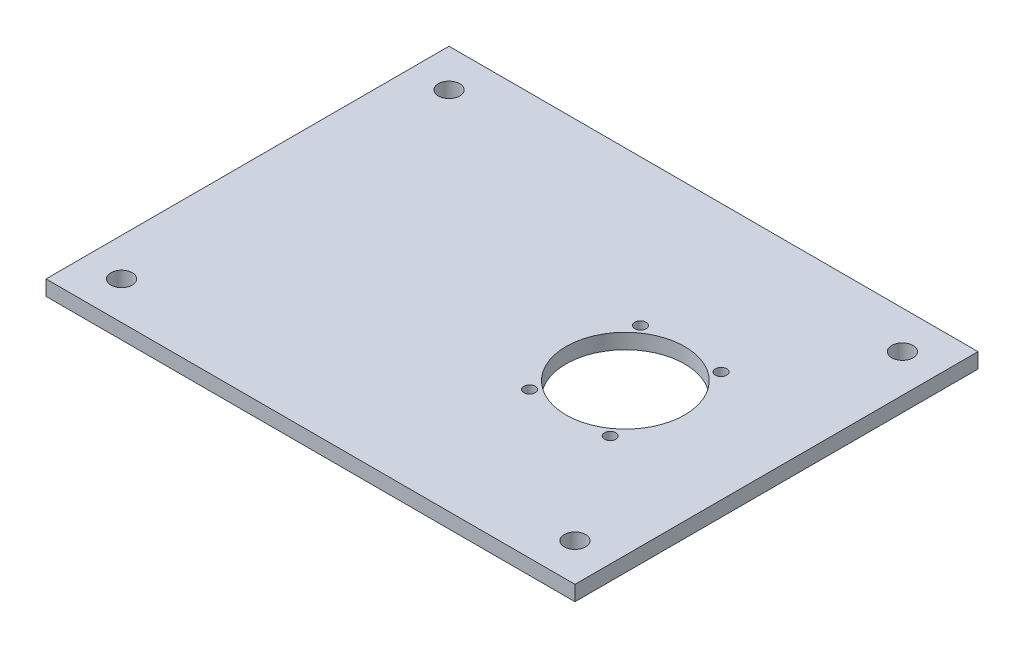
ISO-10303-21;
HEADER;
FILE_DESCRIPTION(('STEP AP214'),'2;1');
FILE_NAME('part.step','',(''),(''),'','','');
FILE_SCHEMA(('AUTOMOTIVE_DESIGN { 1 0 10303 214 1 1 1 1 }'));
ENDSEC;
DATA;
#1=APPLICATION_CONTEXT('core data for automotive mechanical design processes');
#2=APPLICATION_PROTOCOL_DEFINITION('international standard','automotive_design',2000,#1);
#3=PRODUCT_CONTEXT('',#1,'mechanical');
#4=PRODUCT('Part','Part','',(#3));
#5=PRODUCT_RELATED_PRODUCT_CATEGORY('part','',(#4));
#6=PRODUCT_DEFINITION_FORMATION('','',#4);
#7=PRODUCT_DEFINITION_CONTEXT('part definition',#1,'design');
#8=PRODUCT_DEFINITION('design','',#6,#7);
#9=PRODUCT_DEFINITION_SHAPE('','',#8);
#10=(LENGTH_UNIT() NAMED_UNIT(*) SI_UNIT(.MILLI.,.METRE.));
#11=(NAMED_UNIT(*) PLANE_ANGLE_UNIT() SI_UNIT($,.RADIAN.));
#12=(NAMED_UNIT(*) SI_UNIT($,.STERADIAN.) SOLID_ANGLE_UNIT());
#13=UNCERTAINTY_MEASURE_WITH_UNIT(LENGTH_MEASURE(1.E-05),#10,'distance_accuracy_value','');
#14=(GEOMETRIC_REPRESENTATION_CONTEXT(3) GLOBAL_UNCERTAINTY_ASSIGNED_CONTEXT((#13)) GLOBAL_UNIT_ASSIGNED_CONTEXT((#10,
#11,#12)) REPRESENTATION_CONTEXT('',''));
#15=CARTESIAN_POINT('',(0.,0.,0.));
#16=DIRECTION('',(0.,0.,1.));
#17=DIRECTION('',(1.,0.,0.));
#18=AXIS2_PLACEMENT_3D('',#15,#16,#17);
#19=CARTESIAN_POINT('',(0.,6.,0.));
#20=DIRECTION('',(0.,-1.,0.));
#21=DIRECTION('',(0.,0.,-1.));
#22=AXIS2_PLACEMENT_3D('',#19,#20,#21);
#23=PLANE('',#22);
#24=DIRECTION('',(0.,0.,1.));
#25=VECTOR('',#24,1.);
#26=CARTESIAN_POINT('',(-105.,6.,80.));
#27=LINE('',#26,#25);
#28=CARTESIAN_POINT('',(-105.,6.,-80.));
#29=VERTEX_POINT('',#28);
#30=CARTESIAN_POINT('',(-105.,6.,80.));
#31=VERTEX_POINT('',#30);
#32=EDGE_CURVE('E91',#29,#31,#27,.T.);
#33=ORIENTED_EDGE('',*,*,#32,.T.);
#34=DIRECTION('',(1.,0.,0.));
#35=VECTOR('',#34,1.);
#36=CARTESIAN_POINT('',(-105.,6.,80.));
#37=LINE('',#36,#35);
#38=CARTESIAN_POINT('',(105.,6.,80.));
#39=VERTEX_POINT('',#38);
#40=EDGE_CURVE('E86',#31,#39,#37,.T.);
#41=ORIENTED_EDGE('',*,*,#40,.T.);
#42=DIRECTION('',(0.,0.,-1.));
#43=VECTOR('',#42,1.);
#44=CARTESIAN_POINT('',(105.,6.,80.));
#45=LINE('',#44,#43);
#46=CARTESIAN_POINT('',(105.,6.,-80.));
#47=VERTEX_POINT('',#46);
#48=EDGE_CURVE('E87',#39,#47,#45,.T.);
#49=ORIENTED_EDGE('',*,*,#48,.T.);
#50=DIRECTION('',(-1.,0.,0.));
#51=VECTOR('',#50,1.);
#52=CARTESIAN_POINT('',(-105.,6.,-80.));
#53=LINE('',#52,#51);
#54=EDGE_CURVE('E57',#47,#29,#53,.T.);
#55=ORIENTED_EDGE('',*,*,#54,.T.);
#56=EDGE_LOOP('',(#33,#41,#49,#55));
#57=FACE_BOUND('',#56,.T.);
#58=CARTESIAN_POINT('',(45.,6.,0.));
#59=DIRECTION('',(0.,1.,0.));
#60=DIRECTION('',(0.,0.,1.));
#61=AXIS2_PLACEMENT_3D('',#58,#59,#60);
#62=CIRCLE('',#61,23.55);
#63=CARTESIAN_POINT('',(45.,6.,23.55));
#64=VERTEX_POINT('',#63);
#65=EDGE_CURVE('E106',#64,#64,#62,.T.);
#66=ORIENTED_EDGE('',*,*,#65,.F.);
#67=EDGE_LOOP('',(#66));
#68=FACE_BOUND('',#67,.T.);
#69=CARTESIAN_POINT('',(-90.,6.,65.));
#70=DIRECTION('',(0.,1.,0.));
#71=DIRECTION('',(0.,0.,1.));
#72=AXIS2_PLACEMENT_3D('',#69,#70,#71);
#73=CIRCLE('',#72,4.25000000000001);
#74=CARTESIAN_POINT('',(-90.,6.,69.25));
#75=VERTEX_POINT('',#74);
#76=EDGE_CURVE('E123',#75,#75,#73,.T.);
#77=ORIENTED_EDGE('',*,*,#76,.F.);
#78=EDGE_LOOP('',(#77));
#79=FACE_BOUND('',#78,.T.);
#80=CARTESIAN_POINT('',(90.,6.,65.));
#81=DIRECTION('',(0.,1.,0.));
#82=DIRECTION('',(0.,0.,1.));
#83=AXIS2_PLACEMENT_3D('',#80,#81,#82);
#84=CIRCLE('',#83,4.25000000000001);
#85=CARTESIAN_POINT('',(90.,6.,69.25));
#86=VERTEX_POINT('',#85);
#87=EDGE_CURVE('E130',#86,#86,#84,.T.);
#88=ORIENTED_EDGE('',*,*,#87,.F.);
#89=EDGE_LOOP('',(#88));
#90=FACE_BOUND('',#89,.T.);
#91=CARTESIAN_POINT('',(-90.,6.,-65.));
#92=DIRECTION('',(0.,1.,0.));
#93=DIRECTION('',(0.,0.,1.));
#94=AXIS2_PLACEMENT_3D('',#91,#92,#93);
#95=CIRCLE('',#94,4.25000000000001);
#96=CARTESIAN_POINT('',(-90.,6.,-60.75));
#97=VERTEX_POINT('',#96);
#98=EDGE_CURVE('E133',#97,#97,#95,.T.);
#99=ORIENTED_EDGE('',*,*,#98,.F.);
#100=EDGE_LOOP('',(#99));
#101=FACE_BOUND('',#100,.T.);
#102=CARTESIAN_POINT('',(90.,6.,-65.));
#103=DIRECTION('',(0.,1.,0.));
#104=DIRECTION('',(0.,0.,1.));
#105=AXIS2_PLACEMENT_3D('',#102,#103,#104);
#106=CIRCLE('',#105,4.25000000000001);
#107=CARTESIAN_POINT('',(90.,6.,-60.75));
#108=VERTEX_POINT('',#107);
#109=EDGE_CURVE('E137',#108,#108,#106,.T.);
#110=ORIENTED_EDGE('',*,*,#109,.F.);
#111=EDGE_LOOP('',(#110));
#112=FACE_BOUND('',#111,.T.);
#113=CARTESIAN_POINT('',(29.,6.,22.));
#114=DIRECTION('',(0.,1.,0.));
#115=DIRECTION('',(0.,0.,1.));
#116=AXIS2_PLACEMENT_3D('',#113,#114,#115);
#117=CIRCLE('',#116,2.25);
#118=CARTESIAN_POINT('',(29.,6.,24.25));
#119=VERTEX_POINT('',#118);
#120=EDGE_CURVE('E144',#119,#119,#117,.T.);
#121=ORIENTED_EDGE('',*,*,#120,.F.);
#122=EDGE_LOOP('',(#121));
#123=FACE_BOUND('',#122,.T.);
#124=CARTESIAN_POINT('',(61.,6.,22.));
#125=DIRECTION('',(0.,1.,0.));
#126=DIRECTION('',(0.,0.,1.));
#127=AXIS2_PLACEMENT_3D('',#124,#125,#126);
#128=CIRCLE('',#127,2.25);
#129=CARTESIAN_POINT('',(61.,6.,24.25));
#130=VERTEX_POINT('',#129);
#131=EDGE_CURVE('E151',#130,#130,#128,.T.);
#132=ORIENTED_EDGE('',*,*,#131,.F.);
#133=EDGE_LOOP('',(#132));
#134=FACE_BOUND('',#133,.T.);
#135=CARTESIAN_POINT('',(29.,6.,-22.));
#136=DIRECTION('',(0.,1.,0.));
#137=DIRECTION('',(0.,0.,1.));
#138=AXIS2_PLACEMENT_3D('',#135,#136,#137);
#139=CIRCLE('',#138,2.25);
#140=CARTESIAN_POINT('',(29.,6.,-19.75));
#141=VERTEX_POINT('',#140);
#142=EDGE_CURVE('E160',#141,#141,#139,.T.);
#143=ORIENTED_EDGE('',*,*,#142,.F.);
#144=EDGE_LOOP('',(#143));
#145=FACE_BOUND('',#144,.T.);
#146=CARTESIAN_POINT('',(61.,6.,-22.));
#147=DIRECTION('',(0.,1.,0.));
#148=DIRECTION('',(0.,0.,1.));
#149=AXIS2_PLACEMENT_3D('',#146,#147,#148);
#150=CIRCLE('',#149,2.25);
#151=CARTESIAN_POINT('',(61.,6.,-19.75));
#152=VERTEX_POINT('',#151);
#153=EDGE_CURVE('E164',#152,#152,#150,.T.);
#154=ORIENTED_EDGE('',*,*,#153,.F.);
#155=EDGE_LOOP('',(#154));
#156=FACE_BOUND('',#155,.T.);
#157=ADVANCED_FACE('F39',(#57,#68,#79,#90,#101,#112,#123,#134,#145,#156),#23,.F.);
#158=CARTESIAN_POINT('',(0.,0.,0.));
#159=DIRECTION('',(0.,-1.,0.));
#160=DIRECTION('',(0.,0.,-1.));
#161=AXIS2_PLACEMENT_3D('',#158,#159,#160);
#162=PLANE('',#161);
#163=CARTESIAN_POINT('',(29.,0.,-22.));
#164=DIRECTION('',(0.,1.,0.));
#165=DIRECTION('',(0.,0.,1.));
#166=AXIS2_PLACEMENT_3D('',#163,#164,#165);
#167=CIRCLE('',#166,2.25);
#168=CARTESIAN_POINT('',(29.,0.,-19.75));
#169=VERTEX_POINT('',#168);
#170=EDGE_CURVE('E158',#169,#169,#167,.T.);
#171=ORIENTED_EDGE('',*,*,#170,.T.);
#172=EDGE_LOOP('',(#171));
#173=FACE_BOUND('',#172,.T.);
#174=CARTESIAN_POINT('',(29.,0.,22.));
#175=DIRECTION('',(0.,1.,0.));
#176=DIRECTION('',(0.,0.,1.));
#177=AXIS2_PLACEMENT_3D('',#174,#175,#176);
#178=CIRCLE('',#177,2.25);
#179=CARTESIAN_POINT('',(29.,0.,24.25));
#180=VERTEX_POINT('',#179);
#181=EDGE_CURVE('E149',#180,#180,#178,.T.);
#182=ORIENTED_EDGE('',*,*,#181,.T.);
#183=EDGE_LOOP('',(#182));
#184=FACE_BOUND('',#183,.T.);
#185=CARTESIAN_POINT('',(-90.,0.,-65.));
#186=DIRECTION('',(0.,1.,0.));
#187=DIRECTION('',(0.,0.,1.));
#188=AXIS2_PLACEMENT_3D('',#185,#186,#187);
#189=CIRCLE('',#188,4.25000000000001);
#190=CARTESIAN_POINT('',(-90.,0.,-60.75));
#191=VERTEX_POINT('',#190);
#192=EDGE_CURVE('E136',#191,#191,#189,.T.);
#193=ORIENTED_EDGE('',*,*,#192,.T.);
#194=EDGE_LOOP('',(#193));
#195=FACE_BOUND('',#194,.T.);
#196=CARTESIAN_POINT('',(-90.,0.,65.));
#197=DIRECTION('',(0.,1.,0.));
#198=DIRECTION('',(0.,0.,1.));
#199=AXIS2_PLACEMENT_3D('',#196,#197,#198);
#200=CIRCLE('',#199,4.25000000000001);
#201=CARTESIAN_POINT('',(-90.,0.,69.25));
#202=VERTEX_POINT('',#201);
#203=EDGE_CURVE('E125',#202,#202,#200,.T.);
#204=ORIENTED_EDGE('',*,*,#203,.T.);
#205=EDGE_LOOP('',(#204));
#206=FACE_BOUND('',#205,.T.);
#207=DIRECTION('',(0.,0.,1.));
#208=VECTOR('',#207,1.);
#209=CARTESIAN_POINT('',(-105.,0.,80.));
#210=LINE('',#209,#208);
#211=CARTESIAN_POINT('',(-105.,0.,-80.));
#212=VERTEX_POINT('',#211);
#213=CARTESIAN_POINT('',(-105.,0.,80.));
#214=VERTEX_POINT('',#213);
#215=EDGE_CURVE('E104',#212,#214,#210,.T.);
#216=ORIENTED_EDGE('',*,*,#215,.F.);
#217=DIRECTION('',(-1.,0.,0.));
#218=VECTOR('',#217,1.);
#219=CARTESIAN_POINT('',(-105.,0.,-80.));
#220=LINE('',#219,#218);
#221=CARTESIAN_POINT('',(105.,0.,-80.));
#222=VERTEX_POINT('',#221);
#223=EDGE_CURVE('E80',#222,#212,#220,.T.);
#224=ORIENTED_EDGE('',*,*,#223,.F.);
#225=DIRECTION('',(0.,0.,-1.));
#226=VECTOR('',#225,1.);
#227=CARTESIAN_POINT('',(105.,0.,80.));
#228=LINE('',#227,#226);
#229=CARTESIAN_POINT('',(105.,0.,80.));
#230=VERTEX_POINT('',#229);
#231=EDGE_CURVE('E74',#230,#222,#228,.T.);
#232=ORIENTED_EDGE('',*,*,#231,.F.);
#233=DIRECTION('',(1.,0.,0.));
#234=VECTOR('',#233,1.);
#235=CARTESIAN_POINT('',(-105.,0.,80.));
#236=LINE('',#235,#234);
#237=EDGE_CURVE('E94',#214,#230,#236,.T.);
#238=ORIENTED_EDGE('',*,*,#237,.F.);
#239=EDGE_LOOP('',(#216,#224,#232,#238));
#240=FACE_BOUND('',#239,.T.);
#241=CARTESIAN_POINT('',(45.,0.,0.));
#242=DIRECTION('',(0.,1.,0.));
#243=DIRECTION('',(0.,0.,1.));
#244=AXIS2_PLACEMENT_3D('',#241,#242,#243);
#245=CIRCLE('',#244,23.55);
#246=CARTESIAN_POINT('',(45.,0.,23.55));
#247=VERTEX_POINT('',#246);
#248=EDGE_CURVE('E119',#247,#247,#245,.T.);
#249=ORIENTED_EDGE('',*,*,#248,.T.);
#250=EDGE_LOOP('',(#249));
#251=FACE_BOUND('',#250,.T.);
#252=CARTESIAN_POINT('',(90.,0.,65.));
#253=DIRECTION('',(0.,1.,0.));
#254=DIRECTION('',(0.,0.,1.));
#255=AXIS2_PLACEMENT_3D('',#252,#253,#254);
#256=CIRCLE('',#255,4.25000000000001);
#257=CARTESIAN_POINT('',(90.,0.,69.25));
#258=VERTEX_POINT('',#257);
#259=EDGE_CURVE('E127',#258,#258,#256,.T.);
#260=ORIENTED_EDGE('',*,*,#259,.T.);
#261=EDGE_LOOP('',(#260));
#262=FACE_BOUND('',#261,.T.);
#263=CARTESIAN_POINT('',(90.,0.,-65.));
#264=DIRECTION('',(0.,1.,0.));
#265=DIRECTION('',(0.,0.,1.));
#266=AXIS2_PLACEMENT_3D('',#263,#264,#265);
#267=CIRCLE('',#266,4.25000000000001);
#268=CARTESIAN_POINT('',(90.,0.,-60.75));
#269=VERTEX_POINT('',#268);
#270=EDGE_CURVE('E145',#269,#269,#267,.T.);
#271=ORIENTED_EDGE('',*,*,#270,.T.);
#272=EDGE_LOOP('',(#271));
#273=FACE_BOUND('',#272,.T.);
#274=CARTESIAN_POINT('',(61.,0.,22.));
#275=DIRECTION('',(0.,1.,0.));
#276=DIRECTION('',(0.,0.,1.));
#277=AXIS2_PLACEMENT_3D('',#274,#275,#276);
#278=CIRCLE('',#277,2.25);
#279=CARTESIAN_POINT('',(61.,0.,24.25));
#280=VERTEX_POINT('',#279);
#281=EDGE_CURVE('E153',#280,#280,#278,.T.);
#282=ORIENTED_EDGE('',*,*,#281,.T.);
#283=EDGE_LOOP('',(#282));
#284=FACE_BOUND('',#283,.T.);
#285=CARTESIAN_POINT('',(61.,0.,-22.));
#286=DIRECTION('',(0.,1.,0.));
#287=DIRECTION('',(0.,0.,1.));
#288=AXIS2_PLACEMENT_3D('',#285,#286,#287);
#289=CIRCLE('',#288,2.25);
#290=CARTESIAN_POINT('',(61.,0.,-19.75));
#291=VERTEX_POINT('',#290);
#292=EDGE_CURVE('E168',#291,#291,#289,.T.);
#293=ORIENTED_EDGE('',*,*,#292,.T.);
#294=EDGE_LOOP('',(#293));
#295=FACE_BOUND('',#294,.T.);
#296=ADVANCED_FACE('F114',(#173,#184,#195,#206,#240,#251,#262,#273,#284,#295),#162,.T.);
#297=CARTESIAN_POINT('',(-105.,6.,80.));
#298=DIRECTION('',(1.,0.,0.));
#299=DIRECTION('',(0.,0.,-1.));
#300=AXIS2_PLACEMENT_3D('',#297,#298,#299);
#301=PLANE('',#300);
#302=ORIENTED_EDGE('',*,*,#215,.T.);
#303=DIRECTION('',(0.,-1.,0.));
#304=VECTOR('',#303,1.);
#305=CARTESIAN_POINT('',(-105.,6.,80.));
#306=LINE('',#305,#304);
#307=EDGE_CURVE('E11',#31,#214,#306,.T.);
#308=ORIENTED_EDGE('',*,*,#307,.F.);
#309=ORIENTED_EDGE('',*,*,#32,.F.);
#310=DIRECTION('',(0.,-1.,0.));
#311=VECTOR('',#310,1.);
#312=CARTESIAN_POINT('',(-105.,6.,-80.));
#313=LINE('',#312,#311);
#314=EDGE_CURVE('E98',#29,#212,#313,.T.);
#315=ORIENTED_EDGE('',*,*,#314,.T.);
#316=EDGE_LOOP('',(#302,#308,#309,#315));
#317=FACE_BOUND('',#316,.T.);
#318=ADVANCED_FACE('F41',(#317),#301,.F.);
#319=CARTESIAN_POINT('',(-105.,6.,80.));
#320=DIRECTION('',(0.,0.,-1.));
#321=DIRECTION('',(-1.,0.,0.));
#322=AXIS2_PLACEMENT_3D('',#319,#320,#321);
#323=PLANE('',#322);
#324=ORIENTED_EDGE('',*,*,#237,.T.);
#325=DIRECTION('',(0.,-1.,0.));
#326=VECTOR('',#325,1.);
#327=CARTESIAN_POINT('',(105.,6.,80.));
#328=LINE('',#327,#326);
#329=EDGE_CURVE('E48',#39,#230,#328,.T.);
#330=ORIENTED_EDGE('',*,*,#329,.F.);
#331=ORIENTED_EDGE('',*,*,#40,.F.);
#332=ORIENTED_EDGE('',*,*,#307,.T.);
#333=EDGE_LOOP('',(#324,#330,#331,#332));
#334=FACE_BOUND('',#333,.T.);
#335=ADVANCED_FACE('F92',(#334),#323,.F.);
#336=CARTESIAN_POINT('',(105.,6.,80.));
#337=DIRECTION('',(-1.,0.,0.));
#338=DIRECTION('',(0.,0.,1.));
#339=AXIS2_PLACEMENT_3D('',#336,#337,#338);
#340=PLANE('',#339);
#341=ORIENTED_EDGE('',*,*,#231,.T.);
#342=DIRECTION('',(0.,-1.,0.));
#343=VECTOR('',#342,1.);
#344=CARTESIAN_POINT('',(105.,6.,-80.));
#345=LINE('',#344,#343);
#346=EDGE_CURVE('E96',#47,#222,#345,.T.);
#347=ORIENTED_EDGE('',*,*,#346,.F.);
#348=ORIENTED_EDGE('',*,*,#48,.F.);
#349=ORIENTED_EDGE('',*,*,#329,.T.);
#350=EDGE_LOOP('',(#341,#347,#348,#349));
#351=FACE_BOUND('',#350,.T.);
#352=ADVANCED_FACE('F100',(#351),#340,.F.);
#353=CARTESIAN_POINT('',(-105.,6.,-80.));
#354=DIRECTION('',(0.,0.,1.));
#355=DIRECTION('',(1.,0.,0.));
#356=AXIS2_PLACEMENT_3D('',#353,#354,#355);
#357=PLANE('',#356);
#358=ORIENTED_EDGE('',*,*,#223,.T.);
#359=ORIENTED_EDGE('',*,*,#314,.F.);
#360=ORIENTED_EDGE('',*,*,#54,.F.);
#361=ORIENTED_EDGE('',*,*,#346,.T.);
#362=EDGE_LOOP('',(#358,#359,#360,#361));
#363=FACE_BOUND('',#362,.T.);
#364=ADVANCED_FACE('F112',(#363),#357,.F.);
#365=CARTESIAN_POINT('',(45.,6.,0.));
#366=DIRECTION('',(0.,-1.,0.));
#367=DIRECTION('',(0.,0.,-1.));
#368=AXIS2_PLACEMENT_3D('',#365,#366,#367);
#369=CYLINDRICAL_SURFACE('',#368,23.55);
#370=ORIENTED_EDGE('',*,*,#65,.T.);
#371=EDGE_LOOP('',(#370));
#372=FACE_BOUND('',#371,.T.);
#373=ORIENTED_EDGE('',*,*,#248,.F.);
#374=EDGE_LOOP('',(#373));
#375=FACE_BOUND('',#374,.T.);
#376=ADVANCED_FACE('F183',(#372,#375),#369,.F.);
#377=CARTESIAN_POINT('',(-90.,6.,65.));
#378=DIRECTION('',(0.,-1.,0.));
#379=DIRECTION('',(0.,0.,-1.));
#380=AXIS2_PLACEMENT_3D('',#377,#378,#379);
#381=CYLINDRICAL_SURFACE('',#380,4.25000000000001);
#382=ORIENTED_EDGE('',*,*,#76,.T.);
#383=EDGE_LOOP('',(#382));
#384=FACE_BOUND('',#383,.T.);
#385=ORIENTED_EDGE('',*,*,#203,.F.);
#386=EDGE_LOOP('',(#385));
#387=FACE_BOUND('',#386,.T.);
#388=ADVANCED_FACE('F228',(#384,#387),#381,.F.);
#389=CARTESIAN_POINT('',(90.,6.,65.));
#390=DIRECTION('',(0.,-1.,0.));
#391=DIRECTION('',(0.,0.,-1.));
#392=AXIS2_PLACEMENT_3D('',#389,#390,#391);
#393=CYLINDRICAL_SURFACE('',#392,4.25000000000001);
#394=ORIENTED_EDGE('',*,*,#87,.T.);
#395=EDGE_LOOP('',(#394));
#396=FACE_BOUND('',#395,.T.);
#397=ORIENTED_EDGE('',*,*,#259,.F.);
#398=EDGE_LOOP('',(#397));
#399=FACE_BOUND('',#398,.T.);
#400=ADVANCED_FACE('F237',(#396,#399),#393,.F.);
#401=CARTESIAN_POINT('',(-90.,6.,-65.));
#402=DIRECTION('',(0.,-1.,0.));
#403=DIRECTION('',(0.,0.,-1.));
#404=AXIS2_PLACEMENT_3D('',#401,#402,#403);
#405=CYLINDRICAL_SURFACE('',#404,4.25000000000001);
#406=ORIENTED_EDGE('',*,*,#98,.T.);
#407=EDGE_LOOP('',(#406));
#408=FACE_BOUND('',#407,.T.);
#409=ORIENTED_EDGE('',*,*,#192,.F.);
#410=EDGE_LOOP('',(#409));
#411=FACE_BOUND('',#410,.T.);
#412=ADVANCED_FACE('F243',(#408,#411),#405,.F.);
#413=CARTESIAN_POINT('',(90.,6.,-65.));
#414=DIRECTION('',(0.,-1.,0.));
#415=DIRECTION('',(0.,0.,-1.));
#416=AXIS2_PLACEMENT_3D('',#413,#414,#415);
#417=CYLINDRICAL_SURFACE('',#416,4.25000000000001);
#418=ORIENTED_EDGE('',*,*,#109,.T.);
#419=EDGE_LOOP('',(#418));
#420=FACE_BOUND('',#419,.T.);
#421=ORIENTED_EDGE('',*,*,#270,.F.);
#422=EDGE_LOOP('',(#421));
#423=FACE_BOUND('',#422,.T.);
#424=ADVANCED_FACE('F254',(#420,#423),#417,.F.);
#425=CARTESIAN_POINT('',(29.,6.,22.));
#426=DIRECTION('',(0.,-1.,0.));
#427=DIRECTION('',(0.,0.,-1.));
#428=AXIS2_PLACEMENT_3D('',#425,#426,#427);
#429=CYLINDRICAL_SURFACE('',#428,2.25);
#430=ORIENTED_EDGE('',*,*,#120,.T.);
#431=EDGE_LOOP('',(#430));
#432=FACE_BOUND('',#431,.T.);
#433=ORIENTED_EDGE('',*,*,#181,.F.);
#434=EDGE_LOOP('',(#433));
#435=FACE_BOUND('',#434,.T.);
#436=ADVANCED_FACE('F265',(#432,#435),#429,.F.);
#437=CARTESIAN_POINT('',(61.,6.,22.));
#438=DIRECTION('',(0.,-1.,0.));
#439=DIRECTION('',(0.,0.,-1.));
#440=AXIS2_PLACEMENT_3D('',#437,#438,#439);
#441=CYLINDRICAL_SURFACE('',#440,2.25);
#442=ORIENTED_EDGE('',*,*,#131,.T.);
#443=EDGE_LOOP('',(#442));
#444=FACE_BOUND('',#443,.T.);
#445=ORIENTED_EDGE('',*,*,#281,.F.);
#446=EDGE_LOOP('',(#445));
#447=FACE_BOUND('',#446,.T.);
#448=ADVANCED_FACE('F271',(#444,#447),#441,.F.);
#449=CARTESIAN_POINT('',(29.,6.,-22.));
#450=DIRECTION('',(0.,-1.,0.));
#451=DIRECTION('',(0.,0.,-1.));
#452=AXIS2_PLACEMENT_3D('',#449,#450,#451);
#453=CYLINDRICAL_SURFACE('',#452,2.25);
#454=ORIENTED_EDGE('',*,*,#142,.T.);
#455=EDGE_LOOP('',(#454));
#456=FACE_BOUND('',#455,.T.);
#457=ORIENTED_EDGE('',*,*,#170,.F.);
#458=EDGE_LOOP('',(#457));
#459=FACE_BOUND('',#458,.T.);
#460=ADVANCED_FACE('F279',(#456,#459),#453,.F.);
#461=CARTESIAN_POINT('',(61.,6.,-22.));
#462=DIRECTION('',(0.,-1.,0.));
#463=DIRECTION('',(0.,0.,-1.));
#464=AXIS2_PLACEMENT_3D('',#461,#462,#463);
#465=CYLINDRICAL_SURFACE('',#464,2.25);
#466=ORIENTED_EDGE('',*,*,#153,.T.);
#467=EDGE_LOOP('',(#466));
#468=FACE_BOUND('',#467,.T.);
#469=ORIENTED_EDGE('',*,*,#292,.F.);
#470=EDGE_LOOP('',(#469));
#471=FACE_BOUND('',#470,.T.);
#472=ADVANCED_FACE('F175',(#468,#471),#465,.F.);
#473=CLOSED_SHELL('',(#157,#296,#318,#335,#352,#364,#376,#388,#400,#412,#424,#436,#448,#460,#472));
#474=MANIFOLD_SOLID_BREP('B2',#473);
#475=ADVANCED_BREP_SHAPE_REPRESENTATION('',(#18,#474),#14);
#476=SHAPE_DEFINITION_REPRESENTATION(#9,#475);
ENDSEC;
END-ISO-10303-21;
